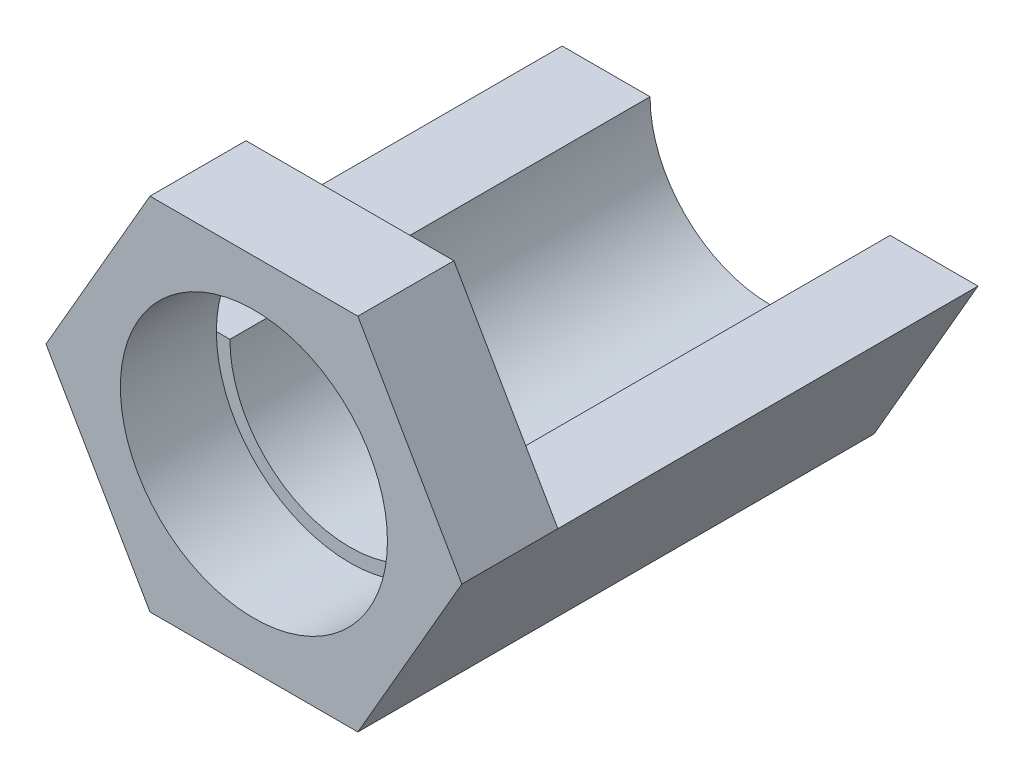
ISO-10303-21;
HEADER;
FILE_DESCRIPTION(('STEP AP214'),'2;1');
FILE_NAME('part.step','',(''),(''),'','','');
FILE_SCHEMA(('AUTOMOTIVE_DESIGN { 1 0 10303 214 1 1 1 1 }'));
ENDSEC;
DATA;
#1=APPLICATION_CONTEXT('core data for automotive mechanical design processes');
#2=APPLICATION_PROTOCOL_DEFINITION('international standard','automotive_design',2000,#1);
#3=PRODUCT_CONTEXT('',#1,'mechanical');
#4=PRODUCT('Part','Part','',(#3));
#5=PRODUCT_RELATED_PRODUCT_CATEGORY('part','',(#4));
#6=PRODUCT_DEFINITION_FORMATION('','',#4);
#7=PRODUCT_DEFINITION_CONTEXT('part definition',#1,'design');
#8=PRODUCT_DEFINITION('design','',#6,#7);
#9=PRODUCT_DEFINITION_SHAPE('','',#8);
#10=(LENGTH_UNIT() NAMED_UNIT(*) SI_UNIT(.MILLI.,.METRE.));
#11=(NAMED_UNIT(*) PLANE_ANGLE_UNIT() SI_UNIT($,.RADIAN.));
#12=(NAMED_UNIT(*) SI_UNIT($,.STERADIAN.) SOLID_ANGLE_UNIT());
#13=UNCERTAINTY_MEASURE_WITH_UNIT(LENGTH_MEASURE(1.E-05),#10,'distance_accuracy_value','');
#14=(GEOMETRIC_REPRESENTATION_CONTEXT(3) GLOBAL_UNCERTAINTY_ASSIGNED_CONTEXT((#13)) GLOBAL_UNIT_ASSIGNED_CONTEXT((#10,
#11,#12)) REPRESENTATION_CONTEXT('',''));
#15=CARTESIAN_POINT('',(0.,0.,0.));
#16=DIRECTION('',(0.,0.,1.));
#17=DIRECTION('',(1.,0.,0.));
#18=AXIS2_PLACEMENT_3D('',#15,#16,#17);
#19=CARTESIAN_POINT('',(0.,0.,-8.));
#20=DIRECTION('',(0.,0.,1.));
#21=DIRECTION('',(1.,0.,0.));
#22=AXIS2_PLACEMENT_3D('',#19,#20,#21);
#23=PLANE('',#22);
#24=DIRECTION('',(1.,0.,0.));
#25=VECTOR('',#24,1.);
#26=CARTESIAN_POINT('',(17.3205080756888,0.,-8.));
#27=LINE('',#26,#25);
#28=CARTESIAN_POINT('',(11.125,0.,-8.));
#29=VERTEX_POINT('',#28);
#30=CARTESIAN_POINT('',(17.3205080756888,0.,-8.));
#31=VERTEX_POINT('',#30);
#32=EDGE_CURVE('E12',#29,#31,#27,.T.);
#33=ORIENTED_EDGE('',*,*,#32,.F.);
#34=CARTESIAN_POINT('',(0.,0.,-8.));
#35=DIRECTION('',(0.,0.,1.));
#36=DIRECTION('',(1.,0.,0.));
#37=AXIS2_PLACEMENT_3D('',#34,#35,#36);
#38=CIRCLE('',#37,11.125);
#39=CARTESIAN_POINT('',(-11.125,0.,-8.));
#40=VERTEX_POINT('',#39);
#41=EDGE_CURVE('E193',#29,#40,#38,.T.);
#42=ORIENTED_EDGE('',*,*,#41,.T.);
#43=DIRECTION('',(1.,0.,0.));
#44=VECTOR('',#43,1.);
#45=CARTESIAN_POINT('',(-17.3205080756888,0.,-8.));
#46=LINE('',#45,#44);
#47=CARTESIAN_POINT('',(-17.3205080756888,0.,-8.));
#48=VERTEX_POINT('',#47);
#49=EDGE_CURVE('E87',#48,#40,#46,.T.);
#50=ORIENTED_EDGE('',*,*,#49,.F.);
#51=DIRECTION('',(-0.5,-0.866025403784439,0.));
#52=VECTOR('',#51,1.);
#53=CARTESIAN_POINT('',(-8.66025403784439,15.,-8.));
#54=LINE('',#53,#52);
#55=CARTESIAN_POINT('',(-8.66025403784439,15.,-8.));
#56=VERTEX_POINT('',#55);
#57=EDGE_CURVE('E204',#56,#48,#54,.T.);
#58=ORIENTED_EDGE('',*,*,#57,.F.);
#59=DIRECTION('',(-1.,0.,0.));
#60=VECTOR('',#59,1.);
#61=CARTESIAN_POINT('',(8.66025403784438,15.,-8.));
#62=LINE('',#61,#60);
#63=CARTESIAN_POINT('',(8.66025403784438,15.,-8.));
#64=VERTEX_POINT('',#63);
#65=EDGE_CURVE('E200',#64,#56,#62,.T.);
#66=ORIENTED_EDGE('',*,*,#65,.F.);
#67=DIRECTION('',(-0.5,0.866025403784438,0.));
#68=VECTOR('',#67,1.);
#69=CARTESIAN_POINT('',(17.3205080756888,0.,-8.));
#70=LINE('',#69,#68);
#71=EDGE_CURVE('E198',#31,#64,#70,.T.);
#72=ORIENTED_EDGE('',*,*,#71,.F.);
#73=EDGE_LOOP('',(#33,#42,#50,#58,#66,#72));
#74=FACE_BOUND('',#73,.T.);
#75=ADVANCED_FACE('F64',(#74),#23,.F.);
#76=CARTESIAN_POINT('',(8.6602540378444,-15.,-8.));
#77=DIRECTION('',(0.866025403784439,-0.5,0.));
#78=DIRECTION('',(0.5,0.866025403784439,0.));
#79=AXIS2_PLACEMENT_3D('',#76,#77,#78);
#80=PLANE('',#79);
#81=DIRECTION('',(0.5,0.866025403784438,0.));
#82=VECTOR('',#81,1.);
#83=CARTESIAN_POINT('',(8.6602540378444,-15.,0.));
#84=LINE('',#83,#82);
#85=CARTESIAN_POINT('',(8.6602540378444,-15.,0.));
#86=VERTEX_POINT('',#85);
#87=CARTESIAN_POINT('',(17.3205080756888,0.,0.));
#88=VERTEX_POINT('',#87);
#89=EDGE_CURVE('E153',#86,#88,#84,.T.);
#90=ORIENTED_EDGE('',*,*,#89,.F.);
#91=DIRECTION('',(0.,0.,1.));
#92=VECTOR('',#91,1.);
#93=CARTESIAN_POINT('',(8.6602540378444,-15.,-8.));
#94=LINE('',#93,#92);
#95=CARTESIAN_POINT('',(8.66025403784439,-15.,-43.));
#96=VERTEX_POINT('',#95);
#97=EDGE_CURVE('E73',#96,#86,#94,.T.);
#98=ORIENTED_EDGE('',*,*,#97,.F.);
#99=DIRECTION('',(-0.5,-0.866025403784439,0.));
#100=VECTOR('',#99,1.);
#101=CARTESIAN_POINT('',(17.3205080756888,0.,-43.));
#102=LINE('',#101,#100);
#103=CARTESIAN_POINT('',(17.3205080756888,0.,-43.));
#104=VERTEX_POINT('',#103);
#105=EDGE_CURVE('E151',#104,#96,#102,.T.);
#106=ORIENTED_EDGE('',*,*,#105,.F.);
#107=DIRECTION('',(0.,0.,1.));
#108=VECTOR('',#107,1.);
#109=CARTESIAN_POINT('',(17.3205080756888,0.,-43.));
#110=LINE('',#109,#108);
#111=EDGE_CURVE('E178',#104,#31,#110,.T.);
#112=ORIENTED_EDGE('',*,*,#111,.T.);
#113=DIRECTION('',(0.,0.,1.));
#114=VECTOR('',#113,1.);
#115=CARTESIAN_POINT('',(17.3205080756888,0.,-8.));
#116=LINE('',#115,#114);
#117=EDGE_CURVE('E68',#31,#88,#116,.T.);
#118=ORIENTED_EDGE('',*,*,#117,.T.);
#119=EDGE_LOOP('',(#90,#98,#106,#112,#118));
#120=FACE_BOUND('',#119,.T.);
#121=ADVANCED_FACE('F66',(#120),#80,.T.);
#122=CARTESIAN_POINT('',(-8.66025403784438,-15.,-8.));
#123=DIRECTION('',(0.,-1.,0.));
#124=DIRECTION('',(0.,0.,-1.));
#125=AXIS2_PLACEMENT_3D('',#122,#123,#124);
#126=PLANE('',#125);
#127=DIRECTION('',(1.,0.,0.));
#128=VECTOR('',#127,1.);
#129=CARTESIAN_POINT('',(-8.66025403784438,-15.,0.));
#130=LINE('',#129,#128);
#131=CARTESIAN_POINT('',(-8.66025403784438,-15.,0.));
#132=VERTEX_POINT('',#131);
#133=EDGE_CURVE('E201',#132,#86,#130,.T.);
#134=ORIENTED_EDGE('',*,*,#133,.F.);
#135=DIRECTION('',(0.,0.,1.));
#136=VECTOR('',#135,1.);
#137=CARTESIAN_POINT('',(-8.66025403784438,-15.,-8.));
#138=LINE('',#137,#136);
#139=CARTESIAN_POINT('',(-8.66025403784439,-15.,-43.));
#140=VERTEX_POINT('',#139);
#141=EDGE_CURVE('E155',#140,#132,#138,.T.);
#142=ORIENTED_EDGE('',*,*,#141,.F.);
#143=DIRECTION('',(-1.,0.,0.));
#144=VECTOR('',#143,1.);
#145=CARTESIAN_POINT('',(8.66025403784439,-15.,-43.));
#146=LINE('',#145,#144);
#147=EDGE_CURVE('E158',#96,#140,#146,.T.);
#148=ORIENTED_EDGE('',*,*,#147,.F.);
#149=ORIENTED_EDGE('',*,*,#97,.T.);
#150=EDGE_LOOP('',(#134,#142,#148,#149));
#151=FACE_BOUND('',#150,.T.);
#152=ADVANCED_FACE('F159',(#151),#126,.T.);
#153=CARTESIAN_POINT('',(-17.3205080756888,0.,-8.));
#154=DIRECTION('',(-0.866025403784438,-0.5,0.));
#155=DIRECTION('',(0.5,-0.866025403784439,0.));
#156=AXIS2_PLACEMENT_3D('',#153,#154,#155);
#157=PLANE('',#156);
#158=DIRECTION('',(0.5,-0.866025403784438,0.));
#159=VECTOR('',#158,1.);
#160=CARTESIAN_POINT('',(-17.3205080756888,0.,0.));
#161=LINE('',#160,#159);
#162=CARTESIAN_POINT('',(-17.3205080756888,0.,0.));
#163=VERTEX_POINT('',#162);
#164=EDGE_CURVE('E217',#163,#132,#161,.T.);
#165=ORIENTED_EDGE('',*,*,#164,.F.);
#166=DIRECTION('',(0.,0.,1.));
#167=VECTOR('',#166,1.);
#168=CARTESIAN_POINT('',(-17.3205080756888,0.,-8.));
#169=LINE('',#168,#167);
#170=EDGE_CURVE('E222',#48,#163,#169,.T.);
#171=ORIENTED_EDGE('',*,*,#170,.F.);
#172=DIRECTION('',(0.,0.,1.));
#173=VECTOR('',#172,1.);
#174=CARTESIAN_POINT('',(-17.3205080756888,0.,-43.));
#175=LINE('',#174,#173);
#176=CARTESIAN_POINT('',(-17.3205080756888,0.,-43.));
#177=VERTEX_POINT('',#176);
#178=EDGE_CURVE('E189',#177,#48,#175,.T.);
#179=ORIENTED_EDGE('',*,*,#178,.F.);
#180=DIRECTION('',(-0.5,0.866025403784439,0.));
#181=VECTOR('',#180,1.);
#182=CARTESIAN_POINT('',(-8.66025403784439,-15.,-43.));
#183=LINE('',#182,#181);
#184=EDGE_CURVE('E162',#140,#177,#183,.T.);
#185=ORIENTED_EDGE('',*,*,#184,.F.);
#186=ORIENTED_EDGE('',*,*,#141,.T.);
#187=EDGE_LOOP('',(#165,#171,#179,#185,#186));
#188=FACE_BOUND('',#187,.T.);
#189=ADVANCED_FACE('F233',(#188),#157,.T.);
#190=CARTESIAN_POINT('',(-8.66025403784439,15.,-8.));
#191=DIRECTION('',(-0.866025403784439,0.5,0.));
#192=DIRECTION('',(-0.5,-0.866025403784439,0.));
#193=AXIS2_PLACEMENT_3D('',#190,#191,#192);
#194=PLANE('',#193);
#195=DIRECTION('',(-0.5,-0.866025403784439,0.));
#196=VECTOR('',#195,1.);
#197=CARTESIAN_POINT('',(-8.66025403784439,15.,0.));
#198=LINE('',#197,#196);
#199=CARTESIAN_POINT('',(-8.66025403784439,15.,0.));
#200=VERTEX_POINT('',#199);
#201=EDGE_CURVE('E214',#200,#163,#198,.T.);
#202=ORIENTED_EDGE('',*,*,#201,.F.);
#203=DIRECTION('',(0.,0.,1.));
#204=VECTOR('',#203,1.);
#205=CARTESIAN_POINT('',(-8.66025403784439,15.,-8.));
#206=LINE('',#205,#204);
#207=EDGE_CURVE('E224',#56,#200,#206,.T.);
#208=ORIENTED_EDGE('',*,*,#207,.F.);
#209=ORIENTED_EDGE('',*,*,#57,.T.);
#210=ORIENTED_EDGE('',*,*,#170,.T.);
#211=EDGE_LOOP('',(#202,#208,#209,#210));
#212=FACE_BOUND('',#211,.T.);
#213=ADVANCED_FACE('F270',(#212),#194,.T.);
#214=CARTESIAN_POINT('',(8.66025403784438,15.,-8.));
#215=DIRECTION('',(0.,1.,0.));
#216=DIRECTION('',(0.,0.,1.));
#217=AXIS2_PLACEMENT_3D('',#214,#215,#216);
#218=PLANE('',#217);
#219=DIRECTION('',(-1.,0.,0.));
#220=VECTOR('',#219,1.);
#221=CARTESIAN_POINT('',(8.66025403784438,15.,0.));
#222=LINE('',#221,#220);
#223=CARTESIAN_POINT('',(8.66025403784438,15.,0.));
#224=VERTEX_POINT('',#223);
#225=EDGE_CURVE('E211',#224,#200,#222,.T.);
#226=ORIENTED_EDGE('',*,*,#225,.F.);
#227=DIRECTION('',(0.,0.,1.));
#228=VECTOR('',#227,1.);
#229=CARTESIAN_POINT('',(8.66025403784438,15.,-8.));
#230=LINE('',#229,#228);
#231=EDGE_CURVE('E225',#64,#224,#230,.T.);
#232=ORIENTED_EDGE('',*,*,#231,.F.);
#233=ORIENTED_EDGE('',*,*,#65,.T.);
#234=ORIENTED_EDGE('',*,*,#207,.T.);
#235=EDGE_LOOP('',(#226,#232,#233,#234));
#236=FACE_BOUND('',#235,.T.);
#237=ADVANCED_FACE('F273',(#236),#218,.T.);
#238=CARTESIAN_POINT('',(17.3205080756888,0.,-8.));
#239=DIRECTION('',(0.866025403784438,0.5,0.));
#240=DIRECTION('',(-0.5,0.866025403784438,0.));
#241=AXIS2_PLACEMENT_3D('',#238,#239,#240);
#242=PLANE('',#241);
#243=DIRECTION('',(-0.5,0.866025403784438,0.));
#244=VECTOR('',#243,1.);
#245=CARTESIAN_POINT('',(17.3205080756888,0.,0.));
#246=LINE('',#245,#244);
#247=EDGE_CURVE('E208',#88,#224,#246,.T.);
#248=ORIENTED_EDGE('',*,*,#247,.F.);
#249=ORIENTED_EDGE('',*,*,#117,.F.);
#250=ORIENTED_EDGE('',*,*,#71,.T.);
#251=ORIENTED_EDGE('',*,*,#231,.T.);
#252=EDGE_LOOP('',(#248,#249,#250,#251));
#253=FACE_BOUND('',#252,.T.);
#254=ADVANCED_FACE('F227',(#253),#242,.T.);
#255=CARTESIAN_POINT('',(0.,0.,0.));
#256=DIRECTION('',(0.,0.,1.));
#257=DIRECTION('',(1.,0.,0.));
#258=AXIS2_PLACEMENT_3D('',#255,#256,#257);
#259=PLANE('',#258);
#260=CARTESIAN_POINT('',(0.,0.,0.));
#261=DIRECTION('',(0.,0.,1.));
#262=DIRECTION('',(1.,0.,0.));
#263=AXIS2_PLACEMENT_3D('',#260,#261,#262);
#264=CIRCLE('',#263,11.125);
#265=CARTESIAN_POINT('',(11.125,0.,0.));
#266=VERTEX_POINT('',#265);
#267=EDGE_CURVE('E192',#266,#266,#264,.T.);
#268=ORIENTED_EDGE('',*,*,#267,.F.);
#269=EDGE_LOOP('',(#268));
#270=FACE_BOUND('',#269,.T.);
#271=ORIENTED_EDGE('',*,*,#89,.T.);
#272=ORIENTED_EDGE('',*,*,#247,.T.);
#273=ORIENTED_EDGE('',*,*,#225,.T.);
#274=ORIENTED_EDGE('',*,*,#201,.T.);
#275=ORIENTED_EDGE('',*,*,#164,.T.);
#276=ORIENTED_EDGE('',*,*,#133,.T.);
#277=EDGE_LOOP('',(#271,#272,#273,#274,#275,#276));
#278=FACE_BOUND('',#277,.T.);
#279=ADVANCED_FACE('F229',(#270,#278),#259,.T.);
#280=CARTESIAN_POINT('',(0.,0.,-8.));
#281=DIRECTION('',(0.,0.,1.));
#282=DIRECTION('',(1.,0.,0.));
#283=AXIS2_PLACEMENT_3D('',#280,#281,#282);
#284=CYLINDRICAL_SURFACE('',#283,11.125);
#285=ORIENTED_EDGE('',*,*,#41,.F.);
#286=EDGE_CURVE('E195',#40,#29,#38,.T.);
#287=ORIENTED_EDGE('',*,*,#286,.F.);
#288=EDGE_LOOP('',(#285,#287));
#289=FACE_BOUND('',#288,.T.);
#290=ORIENTED_EDGE('',*,*,#267,.T.);
#291=EDGE_LOOP('',(#290));
#292=FACE_BOUND('',#291,.T.);
#293=ADVANCED_FACE('F253',(#289,#292),#284,.F.);
#294=CARTESIAN_POINT('',(0.,0.,-8.));
#295=DIRECTION('',(0.,0.,-1.));
#296=DIRECTION('',(-1.,0.,0.));
#297=AXIS2_PLACEMENT_3D('',#294,#295,#296);
#298=PLANE('',#297);
#299=CARTESIAN_POINT('',(-10.,0.,-8.));
#300=VERTEX_POINT('',#299);
#301=EDGE_CURVE('E180',#40,#300,#46,.T.);
#302=ORIENTED_EDGE('',*,*,#301,.F.);
#303=ORIENTED_EDGE('',*,*,#286,.T.);
#304=CARTESIAN_POINT('',(10.,0.,-8.));
#305=VERTEX_POINT('',#304);
#306=EDGE_CURVE('E75',#305,#29,#27,.T.);
#307=ORIENTED_EDGE('',*,*,#306,.F.);
#308=CARTESIAN_POINT('',(0.,0.,-8.));
#309=DIRECTION('',(0.,0.,1.));
#310=DIRECTION('',(-1.,0.,0.));
#311=AXIS2_PLACEMENT_3D('',#308,#309,#310);
#312=CIRCLE('',#311,10.);
#313=EDGE_CURVE('E170',#300,#305,#312,.T.);
#314=ORIENTED_EDGE('',*,*,#313,.F.);
#315=EDGE_LOOP('',(#302,#303,#307,#314));
#316=FACE_BOUND('',#315,.T.);
#317=ADVANCED_FACE('F250',(#316),#298,.F.);
#318=CARTESIAN_POINT('',(-17.3205080756888,0.,-43.));
#319=DIRECTION('',(0.,-1.,0.));
#320=DIRECTION('',(1.,0.,0.));
#321=AXIS2_PLACEMENT_3D('',#318,#319,#320);
#322=PLANE('',#321);
#323=ORIENTED_EDGE('',*,*,#49,.T.);
#324=ORIENTED_EDGE('',*,*,#301,.T.);
#325=DIRECTION('',(0.,0.,1.));
#326=VECTOR('',#325,1.);
#327=CARTESIAN_POINT('',(-10.,0.,-43.));
#328=LINE('',#327,#326);
#329=CARTESIAN_POINT('',(-10.,0.,-43.));
#330=VERTEX_POINT('',#329);
#331=EDGE_CURVE('E186',#330,#300,#328,.T.);
#332=ORIENTED_EDGE('',*,*,#331,.F.);
#333=DIRECTION('',(1.,0.,0.));
#334=VECTOR('',#333,1.);
#335=CARTESIAN_POINT('',(-17.3205080756888,0.,-43.));
#336=LINE('',#335,#334);
#337=EDGE_CURVE('E173',#177,#330,#336,.T.);
#338=ORIENTED_EDGE('',*,*,#337,.F.);
#339=ORIENTED_EDGE('',*,*,#178,.T.);
#340=EDGE_LOOP('',(#323,#324,#332,#338,#339));
#341=FACE_BOUND('',#340,.T.);
#342=ADVANCED_FACE('F240',(#341),#322,.F.);
#343=CARTESIAN_POINT('',(0.,0.,-43.));
#344=DIRECTION('',(0.,0.,1.));
#345=DIRECTION('',(1.,0.,0.));
#346=AXIS2_PLACEMENT_3D('',#343,#344,#345);
#347=CYLINDRICAL_SURFACE('',#346,10.);
#348=ORIENTED_EDGE('',*,*,#313,.T.);
#349=DIRECTION('',(0.,0.,1.));
#350=VECTOR('',#349,1.);
#351=CARTESIAN_POINT('',(10.,0.,-43.));
#352=LINE('',#351,#350);
#353=CARTESIAN_POINT('',(10.,0.,-43.));
#354=VERTEX_POINT('',#353);
#355=EDGE_CURVE('E183',#354,#305,#352,.T.);
#356=ORIENTED_EDGE('',*,*,#355,.F.);
#357=CARTESIAN_POINT('',(0.,0.,-43.));
#358=DIRECTION('',(0.,0.,1.));
#359=DIRECTION('',(-1.,0.,0.));
#360=AXIS2_PLACEMENT_3D('',#357,#358,#359);
#361=CIRCLE('',#360,10.);
#362=EDGE_CURVE('E175',#330,#354,#361,.T.);
#363=ORIENTED_EDGE('',*,*,#362,.F.);
#364=ORIENTED_EDGE('',*,*,#331,.T.);
#365=EDGE_LOOP('',(#348,#356,#363,#364));
#366=FACE_BOUND('',#365,.T.);
#367=ADVANCED_FACE('F244',(#366),#347,.F.);
#368=CARTESIAN_POINT('',(17.3205080756888,0.,-43.));
#369=DIRECTION('',(0.,-1.,0.));
#370=DIRECTION('',(1.,0.,0.));
#371=AXIS2_PLACEMENT_3D('',#368,#369,#370);
#372=PLANE('',#371);
#373=ORIENTED_EDGE('',*,*,#306,.T.);
#374=ORIENTED_EDGE('',*,*,#32,.T.);
#375=ORIENTED_EDGE('',*,*,#111,.F.);
#376=DIRECTION('',(1.,0.,0.));
#377=VECTOR('',#376,1.);
#378=CARTESIAN_POINT('',(17.3205080756888,0.,-43.));
#379=LINE('',#378,#377);
#380=EDGE_CURVE('E166',#354,#104,#379,.T.);
#381=ORIENTED_EDGE('',*,*,#380,.F.);
#382=ORIENTED_EDGE('',*,*,#355,.T.);
#383=EDGE_LOOP('',(#373,#374,#375,#381,#382));
#384=FACE_BOUND('',#383,.T.);
#385=ADVANCED_FACE('F247',(#384),#372,.F.);
#386=CARTESIAN_POINT('',(0.,0.,-43.));
#387=DIRECTION('',(0.,0.,-1.));
#388=DIRECTION('',(-1.,0.,0.));
#389=AXIS2_PLACEMENT_3D('',#386,#387,#388);
#390=PLANE('',#389);
#391=ORIENTED_EDGE('',*,*,#105,.T.);
#392=ORIENTED_EDGE('',*,*,#147,.T.);
#393=ORIENTED_EDGE('',*,*,#184,.T.);
#394=ORIENTED_EDGE('',*,*,#337,.T.);
#395=ORIENTED_EDGE('',*,*,#362,.T.);
#396=ORIENTED_EDGE('',*,*,#380,.T.);
#397=EDGE_LOOP('',(#391,#392,#393,#394,#395,#396));
#398=FACE_BOUND('',#397,.T.);
#399=ADVANCED_FACE('F164',(#398),#390,.T.);
#400=CLOSED_SHELL('',(#75,#121,#152,#189,#213,#237,#254,#279,#293,#317,#342,#367,#385,#399));
#401=MANIFOLD_SOLID_BREP('B2',#400);
#402=ADVANCED_BREP_SHAPE_REPRESENTATION('',(#18,#401),#14);
#403=SHAPE_DEFINITION_REPRESENTATION(#9,#402);
ENDSEC;
END-ISO-10303-21;
